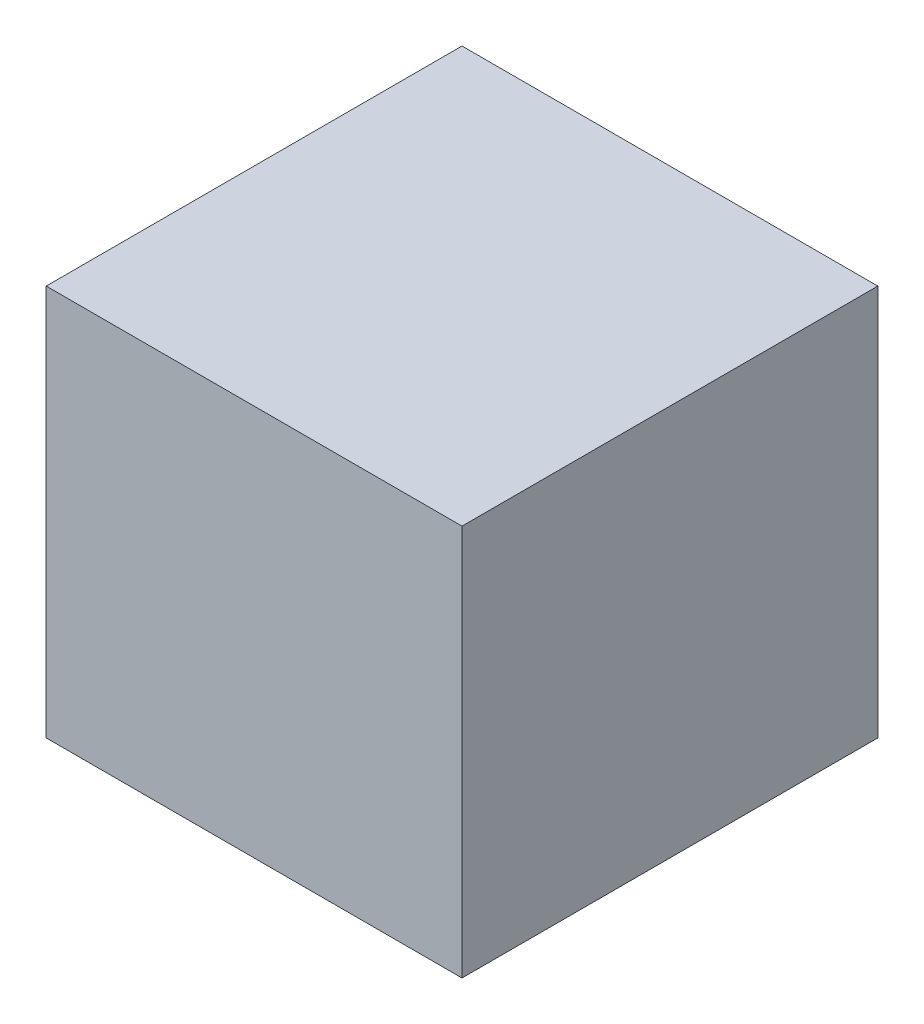
ISO-10303-21;
HEADER;
FILE_DESCRIPTION(('STEP AP214'),'2;1');
FILE_NAME('part.step','',(''),(''),'','','');
FILE_SCHEMA(('AUTOMOTIVE_DESIGN { 1 0 10303 214 1 1 1 1 }'));
ENDSEC;
DATA;
#1=APPLICATION_CONTEXT('core data for automotive mechanical design processes');
#2=APPLICATION_PROTOCOL_DEFINITION('international standard','automotive_design',2000,#1);
#3=PRODUCT_CONTEXT('',#1,'mechanical');
#4=PRODUCT('Part','Part','',(#3));
#5=PRODUCT_RELATED_PRODUCT_CATEGORY('part','',(#4));
#6=PRODUCT_DEFINITION_FORMATION('','',#4);
#7=PRODUCT_DEFINITION_CONTEXT('part definition',#1,'design');
#8=PRODUCT_DEFINITION('design','',#6,#7);
#9=PRODUCT_DEFINITION_SHAPE('','',#8);
#10=(LENGTH_UNIT() NAMED_UNIT(*) SI_UNIT(.MILLI.,.METRE.));
#11=(NAMED_UNIT(*) PLANE_ANGLE_UNIT() SI_UNIT($,.RADIAN.));
#12=(NAMED_UNIT(*) SI_UNIT($,.STERADIAN.) SOLID_ANGLE_UNIT());
#13=UNCERTAINTY_MEASURE_WITH_UNIT(LENGTH_MEASURE(1.E-05),#10,'distance_accuracy_value','');
#14=(GEOMETRIC_REPRESENTATION_CONTEXT(3) GLOBAL_UNCERTAINTY_ASSIGNED_CONTEXT((#13)) GLOBAL_UNIT_ASSIGNED_CONTEXT((#10,
#11,#12)) REPRESENTATION_CONTEXT('',''));
#15=CARTESIAN_POINT('',(0.,0.,0.));
#16=DIRECTION('',(0.,0.,1.));
#17=DIRECTION('',(1.,0.,0.));
#18=AXIS2_PLACEMENT_3D('',#15,#16,#17);
#19=CARTESIAN_POINT('',(42.5,80.,42.5));
#20=DIRECTION('',(-1.,0.,0.));
#21=DIRECTION('',(0.,0.,1.));
#22=AXIS2_PLACEMENT_3D('',#19,#20,#21);
#23=PLANE('',#22);
#24=DIRECTION('',(0.,0.,-1.));
#25=VECTOR('',#24,1.);
#26=CARTESIAN_POINT('',(42.5,0.,42.5));
#27=LINE('',#26,#25);
#28=CARTESIAN_POINT('',(42.5,0.,42.5));
#29=VERTEX_POINT('',#28);
#30=CARTESIAN_POINT('',(42.5,0.,-42.5));
#31=VERTEX_POINT('',#30);
#32=EDGE_CURVE('E96',#29,#31,#27,.T.);
#33=ORIENTED_EDGE('',*,*,#32,.T.);
#34=DIRECTION('',(0.,-1.,0.));
#35=VECTOR('',#34,1.);
#36=CARTESIAN_POINT('',(42.5,80.,-42.5));
#37=LINE('',#36,#35);
#38=CARTESIAN_POINT('',(42.5,80.,-42.5));
#39=VERTEX_POINT('',#38);
#40=EDGE_CURVE('E11',#39,#31,#37,.T.);
#41=ORIENTED_EDGE('',*,*,#40,.F.);
#42=DIRECTION('',(0.,0.,-1.));
#43=VECTOR('',#42,1.);
#44=CARTESIAN_POINT('',(42.5,80.,42.5));
#45=LINE('',#44,#43);
#46=CARTESIAN_POINT('',(42.5,80.,42.5));
#47=VERTEX_POINT('',#46);
#48=EDGE_CURVE('E84',#47,#39,#45,.T.);
#49=ORIENTED_EDGE('',*,*,#48,.F.);
#50=DIRECTION('',(0.,-1.,0.));
#51=VECTOR('',#50,1.);
#52=CARTESIAN_POINT('',(42.5,80.,42.5));
#53=LINE('',#52,#51);
#54=EDGE_CURVE('E92',#47,#29,#53,.T.);
#55=ORIENTED_EDGE('',*,*,#54,.T.);
#56=EDGE_LOOP('',(#33,#41,#49,#55));
#57=FACE_BOUND('',#56,.T.);
#58=ADVANCED_FACE('F33',(#57),#23,.F.);
#59=CARTESIAN_POINT('',(-42.5,80.,-42.5));
#60=DIRECTION('',(0.,0.,1.));
#61=DIRECTION('',(1.,0.,0.));
#62=AXIS2_PLACEMENT_3D('',#59,#60,#61);
#63=PLANE('',#62);
#64=DIRECTION('',(-1.,0.,0.));
#65=VECTOR('',#64,1.);
#66=CARTESIAN_POINT('',(-42.5,0.,-42.5));
#67=LINE('',#66,#65);
#68=CARTESIAN_POINT('',(-42.5,0.,-42.5));
#69=VERTEX_POINT('',#68);
#70=EDGE_CURVE('E88',#31,#69,#67,.T.);
#71=ORIENTED_EDGE('',*,*,#70,.T.);
#72=DIRECTION('',(0.,-1.,0.));
#73=VECTOR('',#72,1.);
#74=CARTESIAN_POINT('',(-42.5,80.,-42.5));
#75=LINE('',#74,#73);
#76=CARTESIAN_POINT('',(-42.5,80.,-42.5));
#77=VERTEX_POINT('',#76);
#78=EDGE_CURVE('E41',#77,#69,#75,.T.);
#79=ORIENTED_EDGE('',*,*,#78,.F.);
#80=DIRECTION('',(-1.,0.,0.));
#81=VECTOR('',#80,1.);
#82=CARTESIAN_POINT('',(-42.5,80.,-42.5));
#83=LINE('',#82,#81);
#84=EDGE_CURVE('E79',#39,#77,#83,.T.);
#85=ORIENTED_EDGE('',*,*,#84,.F.);
#86=ORIENTED_EDGE('',*,*,#40,.T.);
#87=EDGE_LOOP('',(#71,#79,#85,#86));
#88=FACE_BOUND('',#87,.T.);
#89=ADVANCED_FACE('F87',(#88),#63,.F.);
#90=CARTESIAN_POINT('',(-42.5,80.,42.5));
#91=DIRECTION('',(1.,0.,0.));
#92=DIRECTION('',(0.,0.,-1.));
#93=AXIS2_PLACEMENT_3D('',#90,#91,#92);
#94=PLANE('',#93);
#95=DIRECTION('',(0.,0.,1.));
#96=VECTOR('',#95,1.);
#97=CARTESIAN_POINT('',(-42.5,0.,42.5));
#98=LINE('',#97,#96);
#99=CARTESIAN_POINT('',(-42.5,0.,42.5));
#100=VERTEX_POINT('',#99);
#101=EDGE_CURVE('E66',#69,#100,#98,.T.);
#102=ORIENTED_EDGE('',*,*,#101,.T.);
#103=DIRECTION('',(0.,-1.,0.));
#104=VECTOR('',#103,1.);
#105=CARTESIAN_POINT('',(-42.5,80.,42.5));
#106=LINE('',#105,#104);
#107=CARTESIAN_POINT('',(-42.5,80.,42.5));
#108=VERTEX_POINT('',#107);
#109=EDGE_CURVE('E89',#108,#100,#106,.T.);
#110=ORIENTED_EDGE('',*,*,#109,.F.);
#111=DIRECTION('',(0.,0.,1.));
#112=VECTOR('',#111,1.);
#113=CARTESIAN_POINT('',(-42.5,80.,42.5));
#114=LINE('',#113,#112);
#115=EDGE_CURVE('E82',#77,#108,#114,.T.);
#116=ORIENTED_EDGE('',*,*,#115,.F.);
#117=ORIENTED_EDGE('',*,*,#78,.T.);
#118=EDGE_LOOP('',(#102,#110,#116,#117));
#119=FACE_BOUND('',#118,.T.);
#120=ADVANCED_FACE('F90',(#119),#94,.F.);
#121=CARTESIAN_POINT('',(-42.5,80.,42.5));
#122=DIRECTION('',(0.,0.,-1.));
#123=DIRECTION('',(-1.,0.,0.));
#124=AXIS2_PLACEMENT_3D('',#121,#122,#123);
#125=PLANE('',#124);
#126=DIRECTION('',(1.,0.,0.));
#127=VECTOR('',#126,1.);
#128=CARTESIAN_POINT('',(-42.5,0.,42.5));
#129=LINE('',#128,#127);
#130=EDGE_CURVE('E72',#100,#29,#129,.T.);
#131=ORIENTED_EDGE('',*,*,#130,.T.);
#132=ORIENTED_EDGE('',*,*,#54,.F.);
#133=DIRECTION('',(1.,0.,0.));
#134=VECTOR('',#133,1.);
#135=CARTESIAN_POINT('',(-42.5,80.,42.5));
#136=LINE('',#135,#134);
#137=EDGE_CURVE('E49',#108,#47,#136,.T.);
#138=ORIENTED_EDGE('',*,*,#137,.F.);
#139=ORIENTED_EDGE('',*,*,#109,.T.);
#140=EDGE_LOOP('',(#131,#132,#138,#139));
#141=FACE_BOUND('',#140,.T.);
#142=ADVANCED_FACE('F103',(#141),#125,.F.);
#143=CARTESIAN_POINT('',(0.,80.,0.));
#144=DIRECTION('',(0.,-1.,0.));
#145=DIRECTION('',(0.,0.,-1.));
#146=AXIS2_PLACEMENT_3D('',#143,#144,#145);
#147=PLANE('',#146);
#148=ORIENTED_EDGE('',*,*,#48,.T.);
#149=ORIENTED_EDGE('',*,*,#84,.T.);
#150=ORIENTED_EDGE('',*,*,#115,.T.);
#151=ORIENTED_EDGE('',*,*,#137,.T.);
#152=EDGE_LOOP('',(#148,#149,#150,#151));
#153=FACE_BOUND('',#152,.T.);
#154=ADVANCED_FACE('F80',(#153),#147,.F.);
#155=CARTESIAN_POINT('',(0.,0.,0.));
#156=DIRECTION('',(0.,-1.,0.));
#157=DIRECTION('',(0.,0.,-1.));
#158=AXIS2_PLACEMENT_3D('',#155,#156,#157);
#159=PLANE('',#158);
#160=ORIENTED_EDGE('',*,*,#32,.F.);
#161=ORIENTED_EDGE('',*,*,#130,.F.);
#162=ORIENTED_EDGE('',*,*,#101,.F.);
#163=ORIENTED_EDGE('',*,*,#70,.F.);
#164=EDGE_LOOP('',(#160,#161,#162,#163));
#165=FACE_BOUND('',#164,.T.);
#166=ADVANCED_FACE('F106',(#165),#159,.T.);
#167=CLOSED_SHELL('',(#58,#89,#120,#142,#154,#166));
#168=MANIFOLD_SOLID_BREP('B2',#167);
#169=ADVANCED_BREP_SHAPE_REPRESENTATION('',(#18,#168),#14);
#170=SHAPE_DEFINITION_REPRESENTATION(#9,#169);
ENDSEC;
END-ISO-10303-21;
